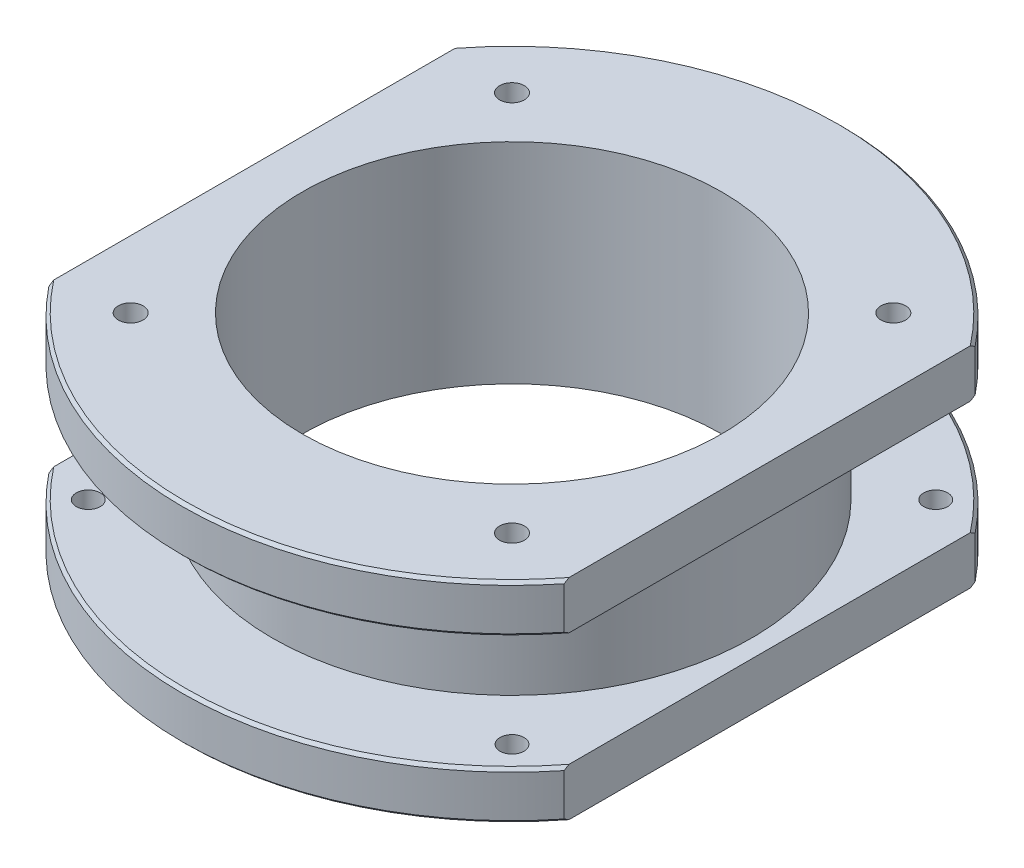
ISO-10303-21;
HEADER;
FILE_DESCRIPTION(('STEP AP214'),'2;1');
FILE_NAME('part.step','',(''),(''),'','','');
FILE_SCHEMA(('AUTOMOTIVE_DESIGN { 1 0 10303 214 1 1 1 1 }'));
ENDSEC;
DATA;
#1=APPLICATION_CONTEXT('core data for automotive mechanical design processes');
#2=APPLICATION_PROTOCOL_DEFINITION('international standard','automotive_design',2000,#1);
#3=PRODUCT_CONTEXT('',#1,'mechanical');
#4=PRODUCT('Part','Part','',(#3));
#5=PRODUCT_RELATED_PRODUCT_CATEGORY('part','',(#4));
#6=PRODUCT_DEFINITION_FORMATION('','',#4);
#7=PRODUCT_DEFINITION_CONTEXT('part definition',#1,'design');
#8=PRODUCT_DEFINITION('design','',#6,#7);
#9=PRODUCT_DEFINITION_SHAPE('','',#8);
#10=(LENGTH_UNIT() NAMED_UNIT(*) SI_UNIT(.MILLI.,.METRE.));
#11=(NAMED_UNIT(*) PLANE_ANGLE_UNIT() SI_UNIT($,.RADIAN.));
#12=(NAMED_UNIT(*) SI_UNIT($,.STERADIAN.) SOLID_ANGLE_UNIT());
#13=UNCERTAINTY_MEASURE_WITH_UNIT(LENGTH_MEASURE(1.E-05),#10,'distance_accuracy_value','');
#14=(GEOMETRIC_REPRESENTATION_CONTEXT(3) GLOBAL_UNCERTAINTY_ASSIGNED_CONTEXT((#13)) GLOBAL_UNIT_ASSIGNED_CONTEXT((#10,
#11,#12)) REPRESENTATION_CONTEXT('',''));
#15=CARTESIAN_POINT('',(0.,0.,0.));
#16=DIRECTION('',(0.,0.,1.));
#17=DIRECTION('',(1.,0.,0.));
#18=AXIS2_PLACEMENT_3D('',#15,#16,#17);
#19=CARTESIAN_POINT('',(0.,17.5,0.));
#20=DIRECTION('',(0.,-1.,0.));
#21=DIRECTION('',(0.,0.,-1.));
#22=AXIS2_PLACEMENT_3D('',#19,#20,#21);
#23=CYLINDRICAL_SURFACE('',#22,40.);
#24=CARTESIAN_POINT('',(0.,8.,0.));
#25=DIRECTION('',(0.,-1.,0.));
#26=DIRECTION('',(1.,0.,0.));
#27=AXIS2_PLACEMENT_3D('',#24,#25,#26);
#28=CIRCLE('',#27,40.);
#29=CARTESIAN_POINT('',(0.,8.,40.));
#30=VERTEX_POINT('',#29);
#31=EDGE_CURVE('E372',#30,#30,#28,.T.);
#32=ORIENTED_EDGE('',*,*,#31,.F.);
#33=DIRECTION('',(0.,1.,0.));
#34=VECTOR('',#33,1.);
#35=CARTESIAN_POINT('',(0.,17.5,40.));
#36=LINE('',#35,#34);
#37=CARTESIAN_POINT('',(0.,27.,40.));
#38=VERTEX_POINT('',#37);
#39=EDGE_CURVE('E11',#30,#38,#36,.T.);
#40=ORIENTED_EDGE('',*,*,#39,.T.);
#41=CARTESIAN_POINT('',(0.,27.,0.));
#42=DIRECTION('',(0.,-1.,0.));
#43=DIRECTION('',(1.,0.,0.));
#44=AXIS2_PLACEMENT_3D('',#41,#42,#43);
#45=CIRCLE('',#44,40.);
#46=EDGE_CURVE('E419',#38,#38,#45,.T.);
#47=ORIENTED_EDGE('',*,*,#46,.T.);
#48=ORIENTED_EDGE('',*,*,#39,.F.);
#49=EDGE_LOOP('',(#32,#40,#47,#48));
#50=FACE_BOUND('',#49,.T.);
#51=ADVANCED_FACE('F17',(#50),#23,.T.);
#52=CARTESIAN_POINT('',(0.,17.5,0.));
#53=DIRECTION('',(0.,-1.,0.));
#54=DIRECTION('',(0.,0.,-1.));
#55=AXIS2_PLACEMENT_3D('',#52,#53,#54);
#56=CYLINDRICAL_SURFACE('',#55,35.);
#57=CARTESIAN_POINT('',(0.,0.,0.));
#58=DIRECTION('',(0.,-1.,0.));
#59=DIRECTION('',(1.,0.,0.));
#60=AXIS2_PLACEMENT_3D('',#57,#58,#59);
#61=CIRCLE('',#60,35.);
#62=CARTESIAN_POINT('',(0.,0.,35.));
#63=VERTEX_POINT('',#62);
#64=EDGE_CURVE('E377',#63,#63,#61,.T.);
#65=ORIENTED_EDGE('',*,*,#64,.T.);
#66=DIRECTION('',(0.,1.,0.));
#67=VECTOR('',#66,1.);
#68=CARTESIAN_POINT('',(0.,17.5,35.));
#69=LINE('',#68,#67);
#70=CARTESIAN_POINT('',(0.,35.,35.));
#71=VERTEX_POINT('',#70);
#72=EDGE_CURVE('E28',#63,#71,#69,.T.);
#73=ORIENTED_EDGE('',*,*,#72,.T.);
#74=CARTESIAN_POINT('',(0.,35.,0.));
#75=DIRECTION('',(0.,-1.,0.));
#76=DIRECTION('',(1.,0.,0.));
#77=AXIS2_PLACEMENT_3D('',#74,#75,#76);
#78=CIRCLE('',#77,35.);
#79=EDGE_CURVE('E294',#71,#71,#78,.T.);
#80=ORIENTED_EDGE('',*,*,#79,.F.);
#81=ORIENTED_EDGE('',*,*,#72,.F.);
#82=EDGE_LOOP('',(#65,#73,#80,#81));
#83=FACE_BOUND('',#82,.T.);
#84=ADVANCED_FACE('F657',(#83),#56,.F.);
#85=CARTESIAN_POINT('',(-31.8198051533946,-124.45218719102,-31.8198051533946));
#86=DIRECTION('',(0.,1.,0.));
#87=DIRECTION('',(1.,0.,0.));
#88=AXIS2_PLACEMENT_3D('',#85,#86,#87);
#89=CYLINDRICAL_SURFACE('',#88,2.067);
#90=CARTESIAN_POINT('',(-31.8198051533946,35.,-31.8198051533946));
#91=DIRECTION('',(0.,-1.,0.));
#92=DIRECTION('',(1.,0.,0.));
#93=AXIS2_PLACEMENT_3D('',#90,#91,#92);
#94=CIRCLE('',#93,2.067);
#95=CARTESIAN_POINT('',(-33.8868051533946,35.,-31.8198051533946));
#96=VERTEX_POINT('',#95);
#97=EDGE_CURVE('E290',#96,#96,#94,.T.);
#98=ORIENTED_EDGE('',*,*,#97,.F.);
#99=DIRECTION('',(0.,-1.,0.));
#100=VECTOR('',#99,1.);
#101=CARTESIAN_POINT('',(-33.8868051533946,-124.45218719102,-31.8198051533946));
#102=LINE('',#101,#100);
#103=CARTESIAN_POINT('',(-33.8868051533946,27.,-31.8198051533946));
#104=VERTEX_POINT('',#103);
#105=EDGE_CURVE('E218',#96,#104,#102,.T.);
#106=ORIENTED_EDGE('',*,*,#105,.T.);
#107=CARTESIAN_POINT('',(-31.8198051533946,27.,-31.8198051533946));
#108=DIRECTION('',(0.,1.,0.));
#109=DIRECTION('',(1.,0.,0.));
#110=AXIS2_PLACEMENT_3D('',#107,#108,#109);
#111=CIRCLE('',#110,2.067);
#112=EDGE_CURVE('E412',#104,#104,#111,.T.);
#113=ORIENTED_EDGE('',*,*,#112,.F.);
#114=ORIENTED_EDGE('',*,*,#105,.F.);
#115=EDGE_LOOP('',(#98,#106,#113,#114));
#116=FACE_BOUND('',#115,.T.);
#117=ADVANCED_FACE('F663',(#116),#89,.F.);
#118=CARTESIAN_POINT('',(31.8198051533946,-124.45218719102,31.8198051533946));
#119=DIRECTION('',(0.,1.,0.));
#120=DIRECTION('',(1.,0.,0.));
#121=AXIS2_PLACEMENT_3D('',#118,#119,#120);
#122=CYLINDRICAL_SURFACE('',#121,2.067);
#123=CARTESIAN_POINT('',(31.8198051533946,35.,31.8198051533946));
#124=DIRECTION('',(0.,-1.,0.));
#125=DIRECTION('',(1.,0.,0.));
#126=AXIS2_PLACEMENT_3D('',#123,#124,#125);
#127=CIRCLE('',#126,2.067);
#128=CARTESIAN_POINT('',(29.7528051533946,35.,31.8198051533946));
#129=VERTEX_POINT('',#128);
#130=EDGE_CURVE('E293',#129,#129,#127,.T.);
#131=ORIENTED_EDGE('',*,*,#130,.F.);
#132=DIRECTION('',(0.,-1.,0.));
#133=VECTOR('',#132,1.);
#134=CARTESIAN_POINT('',(29.7528051533946,-124.45218719102,31.8198051533946));
#135=LINE('',#134,#133);
#136=CARTESIAN_POINT('',(29.7528051533946,27.,31.8198051533946));
#137=VERTEX_POINT('',#136);
#138=EDGE_CURVE('E229',#129,#137,#135,.T.);
#139=ORIENTED_EDGE('',*,*,#138,.T.);
#140=CARTESIAN_POINT('',(31.8198051533946,27.,31.8198051533946));
#141=DIRECTION('',(0.,1.,0.));
#142=DIRECTION('',(1.,0.,0.));
#143=AXIS2_PLACEMENT_3D('',#140,#141,#142);
#144=CIRCLE('',#143,2.067);
#145=EDGE_CURVE('E366',#137,#137,#144,.T.);
#146=ORIENTED_EDGE('',*,*,#145,.F.);
#147=ORIENTED_EDGE('',*,*,#138,.F.);
#148=EDGE_LOOP('',(#131,#139,#146,#147));
#149=FACE_BOUND('',#148,.T.);
#150=ADVANCED_FACE('F700',(#149),#122,.F.);
#151=CARTESIAN_POINT('',(-31.8198051533946,-124.45218719102,31.8198051533946));
#152=DIRECTION('',(0.,1.,0.));
#153=DIRECTION('',(1.,0.,0.));
#154=AXIS2_PLACEMENT_3D('',#151,#152,#153);
#155=CYLINDRICAL_SURFACE('',#154,2.067);
#156=CARTESIAN_POINT('',(-31.8198051533946,35.,31.8198051533946));
#157=DIRECTION('',(0.,-1.,0.));
#158=DIRECTION('',(1.,0.,0.));
#159=AXIS2_PLACEMENT_3D('',#156,#157,#158);
#160=CIRCLE('',#159,2.067);
#161=CARTESIAN_POINT('',(-33.8868051533946,35.,31.8198051533946));
#162=VERTEX_POINT('',#161);
#163=EDGE_CURVE('E480',#162,#162,#160,.T.);
#164=ORIENTED_EDGE('',*,*,#163,.F.);
#165=DIRECTION('',(0.,-1.,0.));
#166=VECTOR('',#165,1.);
#167=CARTESIAN_POINT('',(-33.8868051533946,-124.45218719102,31.8198051533946));
#168=LINE('',#167,#166);
#169=CARTESIAN_POINT('',(-33.8868051533946,27.,31.8198051533946));
#170=VERTEX_POINT('',#169);
#171=EDGE_CURVE('E483',#162,#170,#168,.T.);
#172=ORIENTED_EDGE('',*,*,#171,.T.);
#173=CARTESIAN_POINT('',(-31.8198051533946,27.,31.8198051533946));
#174=DIRECTION('',(0.,1.,0.));
#175=DIRECTION('',(1.,0.,0.));
#176=AXIS2_PLACEMENT_3D('',#173,#174,#175);
#177=CIRCLE('',#176,2.067);
#178=EDGE_CURVE('E362',#170,#170,#177,.T.);
#179=ORIENTED_EDGE('',*,*,#178,.F.);
#180=ORIENTED_EDGE('',*,*,#171,.F.);
#181=EDGE_LOOP('',(#164,#172,#179,#180));
#182=FACE_BOUND('',#181,.T.);
#183=ADVANCED_FACE('F19',(#182),#155,.F.);
#184=CARTESIAN_POINT('',(31.8198051533946,-124.45218719102,-31.8198051533946));
#185=DIRECTION('',(0.,1.,0.));
#186=DIRECTION('',(1.,0.,0.));
#187=AXIS2_PLACEMENT_3D('',#184,#185,#186);
#188=CYLINDRICAL_SURFACE('',#187,2.067);
#189=CARTESIAN_POINT('',(31.8198051533946,35.,-31.8198051533946));
#190=DIRECTION('',(0.,-1.,0.));
#191=DIRECTION('',(1.,0.,0.));
#192=AXIS2_PLACEMENT_3D('',#189,#190,#191);
#193=CIRCLE('',#192,2.067);
#194=CARTESIAN_POINT('',(29.7528051533946,35.,-31.8198051533946));
#195=VERTEX_POINT('',#194);
#196=EDGE_CURVE('E498',#195,#195,#193,.T.);
#197=ORIENTED_EDGE('',*,*,#196,.F.);
#198=DIRECTION('',(0.,-1.,0.));
#199=VECTOR('',#198,1.);
#200=CARTESIAN_POINT('',(29.7528051533946,-124.45218719102,-31.8198051533946));
#201=LINE('',#200,#199);
#202=CARTESIAN_POINT('',(29.7528051533946,27.,-31.8198051533946));
#203=VERTEX_POINT('',#202);
#204=EDGE_CURVE('E42',#195,#203,#201,.T.);
#205=ORIENTED_EDGE('',*,*,#204,.T.);
#206=CARTESIAN_POINT('',(31.8198051533946,27.,-31.8198051533946));
#207=DIRECTION('',(0.,1.,0.));
#208=DIRECTION('',(1.,0.,0.));
#209=AXIS2_PLACEMENT_3D('',#206,#207,#208);
#210=CIRCLE('',#209,2.067);
#211=EDGE_CURVE('E250',#203,#203,#210,.T.);
#212=ORIENTED_EDGE('',*,*,#211,.F.);
#213=ORIENTED_EDGE('',*,*,#204,.F.);
#214=EDGE_LOOP('',(#197,#205,#212,#213));
#215=FACE_BOUND('',#214,.T.);
#216=ADVANCED_FACE('F638',(#215),#188,.F.);
#217=CARTESIAN_POINT('',(-35.3553390593274,159.45218719102,35.3553390593274));
#218=DIRECTION('',(0.,-1.,0.));
#219=DIRECTION('',(1.,0.,0.));
#220=AXIS2_PLACEMENT_3D('',#217,#218,#219);
#221=CYLINDRICAL_SURFACE('',#220,2.);
#222=CARTESIAN_POINT('',(-35.3553390593274,0.,35.3553390593274));
#223=DIRECTION('',(0.,1.,0.));
#224=DIRECTION('',(1.,0.,0.));
#225=AXIS2_PLACEMENT_3D('',#222,#223,#224);
#226=CIRCLE('',#225,2.);
#227=CARTESIAN_POINT('',(-37.3553390593274,0.,35.3553390593274));
#228=VERTEX_POINT('',#227);
#229=EDGE_CURVE('E373',#228,#228,#226,.T.);
#230=ORIENTED_EDGE('',*,*,#229,.F.);
#231=DIRECTION('',(0.,1.,0.));
#232=VECTOR('',#231,1.);
#233=CARTESIAN_POINT('',(-37.3553390593274,159.45218719102,35.3553390593274));
#234=LINE('',#233,#232);
#235=CARTESIAN_POINT('',(-37.3553390593274,8.,35.3553390593274));
#236=VERTEX_POINT('',#235);
#237=EDGE_CURVE('E484',#228,#236,#234,.T.);
#238=ORIENTED_EDGE('',*,*,#237,.T.);
#239=CARTESIAN_POINT('',(-35.3553390593274,8.,35.3553390593274));
#240=DIRECTION('',(0.,-1.,0.));
#241=DIRECTION('',(1.,0.,0.));
#242=AXIS2_PLACEMENT_3D('',#239,#240,#241);
#243=CIRCLE('',#242,2.);
#244=EDGE_CURVE('E367',#236,#236,#243,.T.);
#245=ORIENTED_EDGE('',*,*,#244,.F.);
#246=ORIENTED_EDGE('',*,*,#237,.F.);
#247=EDGE_LOOP('',(#230,#238,#245,#246));
#248=FACE_BOUND('',#247,.T.);
#249=ADVANCED_FACE('F683',(#248),#221,.F.);
#250=CARTESIAN_POINT('',(35.3553390593274,159.45218719102,-35.3553390593274));
#251=DIRECTION('',(0.,-1.,0.));
#252=DIRECTION('',(1.,0.,0.));
#253=AXIS2_PLACEMENT_3D('',#250,#251,#252);
#254=CYLINDRICAL_SURFACE('',#253,2.);
#255=CARTESIAN_POINT('',(35.3553390593274,0.,-35.3553390593274));
#256=DIRECTION('',(0.,1.,0.));
#257=DIRECTION('',(1.,0.,0.));
#258=AXIS2_PLACEMENT_3D('',#255,#256,#257);
#259=CIRCLE('',#258,2.);
#260=CARTESIAN_POINT('',(33.3553390593274,0.,-35.3553390593274));
#261=VERTEX_POINT('',#260);
#262=EDGE_CURVE('E330',#261,#261,#259,.T.);
#263=ORIENTED_EDGE('',*,*,#262,.F.);
#264=DIRECTION('',(0.,1.,0.));
#265=VECTOR('',#264,1.);
#266=CARTESIAN_POINT('',(33.3553390593274,159.45218719102,-35.3553390593274));
#267=LINE('',#266,#265);
#268=CARTESIAN_POINT('',(33.3553390593274,8.,-35.3553390593274));
#269=VERTEX_POINT('',#268);
#270=EDGE_CURVE('E487',#261,#269,#267,.T.);
#271=ORIENTED_EDGE('',*,*,#270,.T.);
#272=CARTESIAN_POINT('',(35.3553390593274,8.,-35.3553390593274));
#273=DIRECTION('',(0.,-1.,0.));
#274=DIRECTION('',(1.,0.,0.));
#275=AXIS2_PLACEMENT_3D('',#272,#273,#274);
#276=CIRCLE('',#275,2.);
#277=EDGE_CURVE('E371',#269,#269,#276,.T.);
#278=ORIENTED_EDGE('',*,*,#277,.F.);
#279=ORIENTED_EDGE('',*,*,#270,.F.);
#280=EDGE_LOOP('',(#263,#271,#278,#279));
#281=FACE_BOUND('',#280,.T.);
#282=ADVANCED_FACE('F686',(#281),#254,.F.);
#283=CARTESIAN_POINT('',(-35.3553390593274,159.45218719102,-35.3553390593274));
#284=DIRECTION('',(0.,-1.,0.));
#285=DIRECTION('',(1.,0.,0.));
#286=AXIS2_PLACEMENT_3D('',#283,#284,#285);
#287=CYLINDRICAL_SURFACE('',#286,2.);
#288=CARTESIAN_POINT('',(-35.3553390593274,0.,-35.3553390593274));
#289=DIRECTION('',(0.,1.,0.));
#290=DIRECTION('',(1.,0.,0.));
#291=AXIS2_PLACEMENT_3D('',#288,#289,#290);
#292=CIRCLE('',#291,2.);
#293=CARTESIAN_POINT('',(-37.3553390593274,0.,-35.3553390593274));
#294=VERTEX_POINT('',#293);
#295=EDGE_CURVE('E323',#294,#294,#292,.T.);
#296=ORIENTED_EDGE('',*,*,#295,.F.);
#297=DIRECTION('',(0.,1.,0.));
#298=VECTOR('',#297,1.);
#299=CARTESIAN_POINT('',(-37.3553390593274,159.45218719102,-35.3553390593274));
#300=LINE('',#299,#298);
#301=CARTESIAN_POINT('',(-37.3553390593274,8.,-35.3553390593274));
#302=VERTEX_POINT('',#301);
#303=EDGE_CURVE('E497',#294,#302,#300,.T.);
#304=ORIENTED_EDGE('',*,*,#303,.T.);
#305=CARTESIAN_POINT('',(-35.3553390593274,8.,-35.3553390593274));
#306=DIRECTION('',(0.,-1.,0.));
#307=DIRECTION('',(1.,0.,0.));
#308=AXIS2_PLACEMENT_3D('',#305,#306,#307);
#309=CIRCLE('',#308,2.);
#310=EDGE_CURVE('E513',#302,#302,#309,.T.);
#311=ORIENTED_EDGE('',*,*,#310,.F.);
#312=ORIENTED_EDGE('',*,*,#303,.F.);
#313=EDGE_LOOP('',(#296,#304,#311,#312));
#314=FACE_BOUND('',#313,.T.);
#315=ADVANCED_FACE('F671',(#314),#287,.F.);
#316=CARTESIAN_POINT('',(35.3553390593274,159.45218719102,35.3553390593274));
#317=DIRECTION('',(0.,-1.,0.));
#318=DIRECTION('',(1.,0.,0.));
#319=AXIS2_PLACEMENT_3D('',#316,#317,#318);
#320=CYLINDRICAL_SURFACE('',#319,2.);
#321=CARTESIAN_POINT('',(35.3553390593274,0.,35.3553390593274));
#322=DIRECTION('',(0.,1.,0.));
#323=DIRECTION('',(1.,0.,0.));
#324=AXIS2_PLACEMENT_3D('',#321,#322,#323);
#325=CIRCLE('',#324,2.);
#326=CARTESIAN_POINT('',(33.3553390593274,0.,35.3553390593274));
#327=VERTEX_POINT('',#326);
#328=EDGE_CURVE('E288',#327,#327,#325,.T.);
#329=ORIENTED_EDGE('',*,*,#328,.F.);
#330=DIRECTION('',(0.,1.,0.));
#331=VECTOR('',#330,1.);
#332=CARTESIAN_POINT('',(33.3553390593274,159.45218719102,35.3553390593274));
#333=LINE('',#332,#331);
#334=CARTESIAN_POINT('',(33.3553390593274,8.,35.3553390593274));
#335=VERTEX_POINT('',#334);
#336=EDGE_CURVE('E494',#327,#335,#333,.T.);
#337=ORIENTED_EDGE('',*,*,#336,.T.);
#338=CARTESIAN_POINT('',(35.3553390593274,8.,35.3553390593274));
#339=DIRECTION('',(0.,-1.,0.));
#340=DIRECTION('',(1.,0.,0.));
#341=AXIS2_PLACEMENT_3D('',#338,#339,#340);
#342=CIRCLE('',#341,2.);
#343=EDGE_CURVE('E21',#335,#335,#342,.T.);
#344=ORIENTED_EDGE('',*,*,#343,.F.);
#345=ORIENTED_EDGE('',*,*,#336,.F.);
#346=EDGE_LOOP('',(#329,#337,#344,#345));
#347=FACE_BOUND('',#346,.T.);
#348=ADVANCED_FACE('F668',(#347),#320,.F.);
#349=CARTESIAN_POINT('',(0.,35.,-55.));
#350=DIRECTION('',(0.,1.,0.));
#351=DIRECTION('',(1.,0.,0.));
#352=AXIS2_PLACEMENT_3D('',#349,#350,#351);
#353=PLANE('',#352);
#354=ORIENTED_EDGE('',*,*,#196,.T.);
#355=EDGE_LOOP('',(#354));
#356=FACE_BOUND('',#355,.T.);
#357=ORIENTED_EDGE('',*,*,#163,.T.);
#358=EDGE_LOOP('',(#357));
#359=FACE_BOUND('',#358,.T.);
#360=ORIENTED_EDGE('',*,*,#130,.T.);
#361=EDGE_LOOP('',(#360));
#362=FACE_BOUND('',#361,.T.);
#363=ORIENTED_EDGE('',*,*,#97,.T.);
#364=EDGE_LOOP('',(#363));
#365=FACE_BOUND('',#364,.T.);
#366=ORIENTED_EDGE('',*,*,#79,.T.);
#367=EDGE_LOOP('',(#366));
#368=FACE_BOUND('',#367,.T.);
#369=DIRECTION('',(0.,0.,-1.));
#370=VECTOR('',#369,1.);
#371=CARTESIAN_POINT('',(43.,35.,-10.3535718005178));
#372=LINE('',#371,#370);
#373=CARTESIAN_POINT('',(43.,35.,33.4850713005064));
#374=VERTEX_POINT('',#373);
#375=CARTESIAN_POINT('',(43.,35.,-33.4850713005064));
#376=VERTEX_POINT('',#375);
#377=EDGE_CURVE('E301',#374,#376,#372,.T.);
#378=ORIENTED_EDGE('',*,*,#377,.T.);
#379=CARTESIAN_POINT('',(0.,35.,0.));
#380=DIRECTION('',(0.,-1.,0.));
#381=DIRECTION('',(0.,0.,1.));
#382=AXIS2_PLACEMENT_3D('',#379,#380,#381);
#383=CIRCLE('',#382,54.5);
#384=CARTESIAN_POINT('',(-43.,35.,-33.4850713005064));
#385=VERTEX_POINT('',#384);
#386=EDGE_CURVE('E284',#385,#376,#383,.T.);
#387=ORIENTED_EDGE('',*,*,#386,.F.);
#388=DIRECTION('',(0.,0.,1.));
#389=VECTOR('',#388,1.);
#390=CARTESIAN_POINT('',(-43.,35.,-44.6464281994822));
#391=LINE('',#390,#389);
#392=CARTESIAN_POINT('',(-43.,35.,33.4850713005064));
#393=VERTEX_POINT('',#392);
#394=EDGE_CURVE('E309',#385,#393,#391,.T.);
#395=ORIENTED_EDGE('',*,*,#394,.T.);
#396=CARTESIAN_POINT('',(0.,35.,0.));
#397=DIRECTION('',(0.,-1.,0.));
#398=DIRECTION('',(0.,0.,1.));
#399=AXIS2_PLACEMENT_3D('',#396,#397,#398);
#400=CIRCLE('',#399,54.5);
#401=EDGE_CURVE('E398',#374,#393,#400,.T.);
#402=ORIENTED_EDGE('',*,*,#401,.F.);
#403=EDGE_LOOP('',(#378,#387,#395,#402));
#404=FACE_BOUND('',#403,.T.);
#405=ADVANCED_FACE('F625',(#356,#359,#362,#365,#368,#404),#353,.T.);
#406=CARTESIAN_POINT('',(0.,8.,-55.));
#407=DIRECTION('',(0.,1.,0.));
#408=DIRECTION('',(1.,0.,0.));
#409=AXIS2_PLACEMENT_3D('',#406,#407,#408);
#410=PLANE('',#409);
#411=ORIENTED_EDGE('',*,*,#343,.T.);
#412=EDGE_LOOP('',(#411));
#413=FACE_BOUND('',#412,.T.);
#414=ORIENTED_EDGE('',*,*,#310,.T.);
#415=EDGE_LOOP('',(#414));
#416=FACE_BOUND('',#415,.T.);
#417=ORIENTED_EDGE('',*,*,#277,.T.);
#418=EDGE_LOOP('',(#417));
#419=FACE_BOUND('',#418,.T.);
#420=ORIENTED_EDGE('',*,*,#244,.T.);
#421=EDGE_LOOP('',(#420));
#422=FACE_BOUND('',#421,.T.);
#423=ORIENTED_EDGE('',*,*,#31,.T.);
#424=EDGE_LOOP('',(#423));
#425=FACE_BOUND('',#424,.T.);
#426=DIRECTION('',(0.,0.,-1.));
#427=VECTOR('',#426,1.);
#428=CARTESIAN_POINT('',(43.,8.,-10.3535718005178));
#429=LINE('',#428,#427);
#430=CARTESIAN_POINT('',(43.,8.,33.4850713005064));
#431=VERTEX_POINT('',#430);
#432=CARTESIAN_POINT('',(43.,8.,-33.4850713005064));
#433=VERTEX_POINT('',#432);
#434=EDGE_CURVE('E341',#431,#433,#429,.T.);
#435=ORIENTED_EDGE('',*,*,#434,.T.);
#436=CARTESIAN_POINT('',(0.,8.,0.));
#437=DIRECTION('',(0.,-1.,0.));
#438=DIRECTION('',(0.,0.,1.));
#439=AXIS2_PLACEMENT_3D('',#436,#437,#438);
#440=CIRCLE('',#439,54.5);
#441=CARTESIAN_POINT('',(-43.,8.,-33.4850713005065));
#442=VERTEX_POINT('',#441);
#443=EDGE_CURVE('E440',#442,#433,#440,.T.);
#444=ORIENTED_EDGE('',*,*,#443,.F.);
#445=DIRECTION('',(0.,0.,1.));
#446=VECTOR('',#445,1.);
#447=CARTESIAN_POINT('',(-43.,8.,-44.6464281994823));
#448=LINE('',#447,#446);
#449=CARTESIAN_POINT('',(-43.,8.,33.4850713005064));
#450=VERTEX_POINT('',#449);
#451=EDGE_CURVE('E425',#442,#450,#448,.T.);
#452=ORIENTED_EDGE('',*,*,#451,.T.);
#453=CARTESIAN_POINT('',(0.,8.,0.));
#454=DIRECTION('',(0.,-1.,0.));
#455=DIRECTION('',(0.,0.,1.));
#456=AXIS2_PLACEMENT_3D('',#453,#454,#455);
#457=CIRCLE('',#456,54.5);
#458=EDGE_CURVE('E394',#431,#450,#457,.T.);
#459=ORIENTED_EDGE('',*,*,#458,.F.);
#460=EDGE_LOOP('',(#435,#444,#452,#459));
#461=FACE_BOUND('',#460,.T.);
#462=ADVANCED_FACE('F673',(#413,#416,#419,#422,#425,#461),#410,.T.);
#463=CARTESIAN_POINT('',(0.,27.25,0.));
#464=DIRECTION('',(0.,1.,0.));
#465=DIRECTION('',(0.,0.,-1.));
#466=AXIS2_PLACEMENT_3D('',#463,#464,#465);
#467=CONICAL_SURFACE('',#466,54.75,0.785398163397448);
#468=CARTESIAN_POINT('',(43.,27.5,-34.2928563989645));
#469=CARTESIAN_POINT('',(43.,27.247020471392,-33.8871195915208));
#470=CARTESIAN_POINT('',(43.,27.,-33.4850713005064));
#471=(BOUNDED_CURVE() B_SPLINE_CURVE(2,(#468,#469,#470),.UNSPECIFIED.,.F.,
.F.) B_SPLINE_CURVE_WITH_KNOTS((3,3),(0.,0.0950010109304205),
.UNSPECIFIED.) CURVE() GEOMETRIC_REPRESENTATION_ITEM() RATIONAL_B_SPLINE_CURVE((1.,
1.00002721140787,1.)) REPRESENTATION_ITEM(''));
#472=CARTESIAN_POINT('',(43.,27.5,-34.2928563989645));
#473=VERTEX_POINT('',#472);
#474=CARTESIAN_POINT('',(43.,27.,-33.4850713005064));
#475=VERTEX_POINT('',#474);
#476=EDGE_CURVE('E254',#473,#475,#471,.T.);
#477=ORIENTED_EDGE('',*,*,#476,.T.);
#478=CARTESIAN_POINT('',(0.,27.,0.));
#479=DIRECTION('',(0.,1.,0.));
#480=DIRECTION('',(0.,0.,1.));
#481=AXIS2_PLACEMENT_3D('',#478,#479,#480);
#482=CIRCLE('',#481,54.5);
#483=CARTESIAN_POINT('',(-43.,27.,-33.4850713005065));
#484=VERTEX_POINT('',#483);
#485=EDGE_CURVE('E238',#475,#484,#482,.T.);
#486=ORIENTED_EDGE('',*,*,#485,.T.);
#487=CARTESIAN_POINT('',(-43.,27.,-33.4850713005064));
#488=CARTESIAN_POINT('',(-43.,27.247020471392,-33.8871195915208));
#489=CARTESIAN_POINT('',(-43.,27.5,-34.2928563989645));
#490=(BOUNDED_CURVE() B_SPLINE_CURVE(2,(#487,#488,#489),.UNSPECIFIED.,.F.,
.F.) B_SPLINE_CURVE_WITH_KNOTS((3,3),(0.,0.0950010109304205),
.UNSPECIFIED.) CURVE() GEOMETRIC_REPRESENTATION_ITEM() RATIONAL_B_SPLINE_CURVE((1.,
1.00002721140787,1.)) REPRESENTATION_ITEM(''));
#491=CARTESIAN_POINT('',(-43.,27.5,-34.2928563989645));
#492=VERTEX_POINT('',#491);
#493=EDGE_CURVE('E389',#484,#492,#490,.T.);
#494=ORIENTED_EDGE('',*,*,#493,.T.);
#495=CARTESIAN_POINT('',(0.,27.5,0.));
#496=DIRECTION('',(0.,-1.,0.));
#497=DIRECTION('',(0.,0.,1.));
#498=AXIS2_PLACEMENT_3D('',#495,#496,#497);
#499=CIRCLE('',#498,55.);
#500=EDGE_CURVE('E256',#492,#473,#499,.T.);
#501=ORIENTED_EDGE('',*,*,#500,.T.);
#502=EDGE_LOOP('',(#477,#486,#494,#501));
#503=FACE_BOUND('',#502,.T.);
#504=ADVANCED_FACE('F255',(#503),#467,.T.);
#505=CARTESIAN_POINT('',(0.,27.25,0.));
#506=DIRECTION('',(0.,1.,0.));
#507=DIRECTION('',(0.,0.,1.));
#508=AXIS2_PLACEMENT_3D('',#505,#506,#507);
#509=CONICAL_SURFACE('',#508,54.75,0.785398163397448);
#510=CARTESIAN_POINT('',(43.,27.,33.4850713005064));
#511=CARTESIAN_POINT('',(43.,27.2470204713927,33.8871195915219));
#512=CARTESIAN_POINT('',(43.,27.5,34.2928563989645));
#513=(BOUNDED_CURVE() B_SPLINE_CURVE(2,(#510,#511,#512),.UNSPECIFIED.,.F.,
.F.) B_SPLINE_CURVE_WITH_KNOTS((3,3),(0.,0.0950010109304205),
.UNSPECIFIED.) CURVE() GEOMETRIC_REPRESENTATION_ITEM() RATIONAL_B_SPLINE_CURVE((1.,
1.0000272114087,1.)) REPRESENTATION_ITEM(''));
#514=CARTESIAN_POINT('',(43.,27.,33.4850713005064));
#515=VERTEX_POINT('',#514);
#516=CARTESIAN_POINT('',(43.,27.5,34.2928563989645));
#517=VERTEX_POINT('',#516);
#518=EDGE_CURVE('E267',#515,#517,#513,.T.);
#519=ORIENTED_EDGE('',*,*,#518,.T.);
#520=CARTESIAN_POINT('',(0.,27.5,0.));
#521=DIRECTION('',(0.,-1.,0.));
#522=DIRECTION('',(0.,0.,1.));
#523=AXIS2_PLACEMENT_3D('',#520,#521,#522);
#524=CIRCLE('',#523,55.);
#525=CARTESIAN_POINT('',(-43.,27.5,34.2928563989645));
#526=VERTEX_POINT('',#525);
#527=EDGE_CURVE('E282',#517,#526,#524,.T.);
#528=ORIENTED_EDGE('',*,*,#527,.T.);
#529=CARTESIAN_POINT('',(-43.,27.5,34.2928563989645));
#530=CARTESIAN_POINT('',(-43.,27.2470204713922,33.8871195915211));
#531=CARTESIAN_POINT('',(-43.,27.,33.4850713005064));
#532=(BOUNDED_CURVE() B_SPLINE_CURVE(2,(#529,#530,#531),.UNSPECIFIED.,.F.,
.F.) B_SPLINE_CURVE_WITH_KNOTS((3,3),(0.,0.0950010109304209),
.UNSPECIFIED.) CURVE() GEOMETRIC_REPRESENTATION_ITEM() RATIONAL_B_SPLINE_CURVE((1.,
1.00002721141701,1.)) REPRESENTATION_ITEM(''));
#533=CARTESIAN_POINT('',(-43.,27.,33.4850713005064));
#534=VERTEX_POINT('',#533);
#535=EDGE_CURVE('E388',#526,#534,#532,.T.);
#536=ORIENTED_EDGE('',*,*,#535,.T.);
#537=CARTESIAN_POINT('',(0.,27.,0.));
#538=DIRECTION('',(0.,1.,0.));
#539=DIRECTION('',(0.,0.,1.));
#540=AXIS2_PLACEMENT_3D('',#537,#538,#539);
#541=CIRCLE('',#540,54.5);
#542=EDGE_CURVE('E251',#534,#515,#541,.T.);
#543=ORIENTED_EDGE('',*,*,#542,.T.);
#544=EDGE_LOOP('',(#519,#528,#536,#543));
#545=FACE_BOUND('',#544,.T.);
#546=ADVANCED_FACE('F642',(#545),#509,.T.);
#547=CARTESIAN_POINT('',(0.,27.,-40.));
#548=DIRECTION('',(0.,-1.,0.));
#549=DIRECTION('',(0.,0.,-1.));
#550=AXIS2_PLACEMENT_3D('',#547,#548,#549);
#551=PLANE('',#550);
#552=ORIENTED_EDGE('',*,*,#46,.F.);
#553=EDGE_LOOP('',(#552));
#554=FACE_BOUND('',#553,.T.);
#555=ORIENTED_EDGE('',*,*,#112,.T.);
#556=EDGE_LOOP('',(#555));
#557=FACE_BOUND('',#556,.T.);
#558=ORIENTED_EDGE('',*,*,#145,.T.);
#559=EDGE_LOOP('',(#558));
#560=FACE_BOUND('',#559,.T.);
#561=ORIENTED_EDGE('',*,*,#178,.T.);
#562=EDGE_LOOP('',(#561));
#563=FACE_BOUND('',#562,.T.);
#564=ORIENTED_EDGE('',*,*,#211,.T.);
#565=EDGE_LOOP('',(#564));
#566=FACE_BOUND('',#565,.T.);
#567=DIRECTION('',(0.,0.,1.));
#568=VECTOR('',#567,1.);
#569=CARTESIAN_POINT('',(43.,27.,-2.85357180051776));
#570=LINE('',#569,#568);
#571=EDGE_CURVE('E242',#475,#515,#570,.T.);
#572=ORIENTED_EDGE('',*,*,#571,.T.);
#573=ORIENTED_EDGE('',*,*,#542,.F.);
#574=DIRECTION('',(0.,0.,-1.));
#575=VECTOR('',#574,1.);
#576=CARTESIAN_POINT('',(-43.,27.,-37.1464281994823));
#577=LINE('',#576,#575);
#578=EDGE_CURVE('E245',#534,#484,#577,.T.);
#579=ORIENTED_EDGE('',*,*,#578,.T.);
#580=ORIENTED_EDGE('',*,*,#485,.F.);
#581=EDGE_LOOP('',(#572,#573,#579,#580));
#582=FACE_BOUND('',#581,.T.);
#583=ADVANCED_FACE('F240',(#554,#557,#560,#563,#566,#582),#551,.T.);
#584=CARTESIAN_POINT('',(0.,31.,0.));
#585=DIRECTION('',(0.,-1.,0.));
#586=DIRECTION('',(0.,0.,-1.));
#587=AXIS2_PLACEMENT_3D('',#584,#585,#586);
#588=CYLINDRICAL_SURFACE('',#587,55.);
#589=DIRECTION('',(0.,-1.,0.));
#590=VECTOR('',#589,1.);
#591=CARTESIAN_POINT('',(43.,31.,-34.2928563989645));
#592=LINE('',#591,#590);
#593=CARTESIAN_POINT('',(43.,34.5,-34.2928563989645));
#594=VERTEX_POINT('',#593);
#595=EDGE_CURVE('E261',#594,#473,#592,.T.);
#596=ORIENTED_EDGE('',*,*,#595,.T.);
#597=ORIENTED_EDGE('',*,*,#500,.F.);
#598=DIRECTION('',(0.,1.,0.));
#599=VECTOR('',#598,1.);
#600=CARTESIAN_POINT('',(-43.,31.,-34.2928563989645));
#601=LINE('',#600,#599);
#602=CARTESIAN_POINT('',(-43.,34.5,-34.2928563989645));
#603=VERTEX_POINT('',#602);
#604=EDGE_CURVE('E411',#492,#603,#601,.T.);
#605=ORIENTED_EDGE('',*,*,#604,.T.);
#606=CARTESIAN_POINT('',(0.,34.5,0.));
#607=DIRECTION('',(0.,1.,0.));
#608=DIRECTION('',(0.,0.,1.));
#609=AXIS2_PLACEMENT_3D('',#606,#607,#608);
#610=CIRCLE('',#609,55.);
#611=EDGE_CURVE('E332',#594,#603,#610,.T.);
#612=ORIENTED_EDGE('',*,*,#611,.F.);
#613=EDGE_LOOP('',(#596,#597,#605,#612));
#614=FACE_BOUND('',#613,.T.);
#615=ADVANCED_FACE('F641',(#614),#588,.T.);
#616=CARTESIAN_POINT('',(0.,31.,0.));
#617=DIRECTION('',(0.,-1.,0.));
#618=DIRECTION('',(0.,0.,1.));
#619=AXIS2_PLACEMENT_3D('',#616,#617,#618);
#620=CYLINDRICAL_SURFACE('',#619,55.);
#621=DIRECTION('',(0.,1.,0.));
#622=VECTOR('',#621,1.);
#623=CARTESIAN_POINT('',(43.,31.,34.2928563989645));
#624=LINE('',#623,#622);
#625=CARTESIAN_POINT('',(43.,34.5,34.2928563989645));
#626=VERTEX_POINT('',#625);
#627=EDGE_CURVE('E274',#517,#626,#624,.T.);
#628=ORIENTED_EDGE('',*,*,#627,.T.);
#629=CARTESIAN_POINT('',(0.,34.5,0.));
#630=DIRECTION('',(0.,1.,0.));
#631=DIRECTION('',(0.,0.,1.));
#632=AXIS2_PLACEMENT_3D('',#629,#630,#631);
#633=CIRCLE('',#632,55.);
#634=CARTESIAN_POINT('',(-43.,34.5,34.2928563989645));
#635=VERTEX_POINT('',#634);
#636=EDGE_CURVE('E457',#635,#626,#633,.T.);
#637=ORIENTED_EDGE('',*,*,#636,.F.);
#638=DIRECTION('',(0.,-1.,0.));
#639=VECTOR('',#638,1.);
#640=CARTESIAN_POINT('',(-43.,31.,34.2928563989645));
#641=LINE('',#640,#639);
#642=EDGE_CURVE('E474',#635,#526,#641,.T.);
#643=ORIENTED_EDGE('',*,*,#642,.T.);
#644=ORIENTED_EDGE('',*,*,#527,.F.);
#645=EDGE_LOOP('',(#628,#637,#643,#644));
#646=FACE_BOUND('',#645,.T.);
#647=ADVANCED_FACE('F622',(#646),#620,.T.);
#648=CARTESIAN_POINT('',(0.,34.75,0.));
#649=DIRECTION('',(0.,-1.,0.));
#650=DIRECTION('',(0.,0.,-1.));
#651=AXIS2_PLACEMENT_3D('',#648,#649,#650);
#652=CONICAL_SURFACE('',#651,54.75,0.785398163397457);
#653=CARTESIAN_POINT('',(43.,35.,-33.4850713005064));
#654=CARTESIAN_POINT('',(43.,34.752979528607,-33.8871195915225));
#655=CARTESIAN_POINT('',(43.,34.5,-34.2928563989645));
#656=(BOUNDED_CURVE() B_SPLINE_CURVE(2,(#653,#654,#655),.UNSPECIFIED.,.F.,
.F.) B_SPLINE_CURVE_WITH_KNOTS((3,3),(0.,0.0950010109304226),
.UNSPECIFIED.) CURVE() GEOMETRIC_REPRESENTATION_ITEM() RATIONAL_B_SPLINE_CURVE((1.,
1.00002721139044,1.)) REPRESENTATION_ITEM(''));
#657=EDGE_CURVE('E295',#376,#594,#656,.T.);
#658=ORIENTED_EDGE('',*,*,#657,.T.);
#659=ORIENTED_EDGE('',*,*,#611,.T.);
#660=CARTESIAN_POINT('',(-43.,34.5,-34.2928563989645));
#661=CARTESIAN_POINT('',(-43.,34.7529795286071,-33.8871195915223));
#662=CARTESIAN_POINT('',(-43.,35.,-33.4850713005064));
#663=(BOUNDED_CURVE() B_SPLINE_CURVE(2,(#660,#661,#662),.UNSPECIFIED.,.F.,
.F.) B_SPLINE_CURVE_WITH_KNOTS((3,3),(0.,0.0950010109304206),
.UNSPECIFIED.) CURVE() GEOMETRIC_REPRESENTATION_ITEM() RATIONAL_B_SPLINE_CURVE((1.,
1.00002721141969,1.)) REPRESENTATION_ITEM(''));
#664=EDGE_CURVE('E313',#603,#385,#663,.T.);
#665=ORIENTED_EDGE('',*,*,#664,.T.);
#666=ORIENTED_EDGE('',*,*,#386,.T.);
#667=EDGE_LOOP('',(#658,#659,#665,#666));
#668=FACE_BOUND('',#667,.T.);
#669=ADVANCED_FACE('F747',(#668),#652,.T.);
#670=CARTESIAN_POINT('',(0.,34.75,0.));
#671=DIRECTION('',(0.,-1.,0.));
#672=DIRECTION('',(0.,0.,1.));
#673=AXIS2_PLACEMENT_3D('',#670,#671,#672);
#674=CONICAL_SURFACE('',#673,54.75,0.785398163397457);
#675=CARTESIAN_POINT('',(43.,34.5,34.2928563989645));
#676=CARTESIAN_POINT('',(43.,34.7529795286072,33.8871195915222));
#677=CARTESIAN_POINT('',(43.,35.,33.4850713005064));
#678=(BOUNDED_CURVE() B_SPLINE_CURVE(2,(#675,#676,#677),.UNSPECIFIED.,.F.,
.F.) B_SPLINE_CURVE_WITH_KNOTS((3,3),(0.,0.0950010109304222),
.UNSPECIFIED.) CURVE() GEOMETRIC_REPRESENTATION_ITEM() RATIONAL_B_SPLINE_CURVE((1.,
1.00002721141784,1.)) REPRESENTATION_ITEM(''));
#679=EDGE_CURVE('E308',#626,#374,#678,.T.);
#680=ORIENTED_EDGE('',*,*,#679,.T.);
#681=ORIENTED_EDGE('',*,*,#401,.T.);
#682=CARTESIAN_POINT('',(-43.,35.,33.4850713005064));
#683=CARTESIAN_POINT('',(-43.,34.7529795286075,33.8871195915216));
#684=CARTESIAN_POINT('',(-43.,34.5,34.2928563989645));
#685=(BOUNDED_CURVE() B_SPLINE_CURVE(2,(#682,#683,#684),.UNSPECIFIED.,.F.,
.F.) B_SPLINE_CURVE_WITH_KNOTS((3,3),(0.,0.0950010109304206),
.UNSPECIFIED.) CURVE() GEOMETRIC_REPRESENTATION_ITEM() RATIONAL_B_SPLINE_CURVE((1.,
1.00002721142132,1.)) REPRESENTATION_ITEM(''));
#686=EDGE_CURVE('E314',#393,#635,#685,.T.);
#687=ORIENTED_EDGE('',*,*,#686,.T.);
#688=ORIENTED_EDGE('',*,*,#636,.T.);
#689=EDGE_LOOP('',(#680,#681,#687,#688));
#690=FACE_BOUND('',#689,.T.);
#691=ADVANCED_FACE('F615',(#690),#674,.T.);
#692=CARTESIAN_POINT('',(0.,0.25,0.));
#693=DIRECTION('',(0.,1.,0.));
#694=DIRECTION('',(0.,0.,-1.));
#695=AXIS2_PLACEMENT_3D('',#692,#693,#694);
#696=CONICAL_SURFACE('',#695,54.75,0.785398163397447);
#697=CARTESIAN_POINT('',(43.,0.5,-34.2928563989645));
#698=CARTESIAN_POINT('',(43.,0.247020471392459,-33.8871195915216));
#699=CARTESIAN_POINT('',(43.,0.,-33.4850713005064));
#700=(BOUNDED_CURVE() B_SPLINE_CURVE(2,(#697,#698,#699),.UNSPECIFIED.,.F.,
.F.) B_SPLINE_CURVE_WITH_KNOTS((3,3),(0.,0.0950010109304191),
.UNSPECIFIED.) CURVE() GEOMETRIC_REPRESENTATION_ITEM() RATIONAL_B_SPLINE_CURVE((1.,
1.00002721141112,1.)) REPRESENTATION_ITEM(''));
#701=CARTESIAN_POINT('',(43.,0.5,-34.2928563989645));
#702=VERTEX_POINT('',#701);
#703=CARTESIAN_POINT('',(43.,0.,-33.4850713005064));
#704=VERTEX_POINT('',#703);
#705=EDGE_CURVE('E351',#702,#704,#700,.T.);
#706=ORIENTED_EDGE('',*,*,#705,.T.);
#707=CARTESIAN_POINT('',(0.,0.,0.));
#708=DIRECTION('',(0.,1.,0.));
#709=DIRECTION('',(0.,0.,1.));
#710=AXIS2_PLACEMENT_3D('',#707,#708,#709);
#711=CIRCLE('',#710,54.5);
#712=CARTESIAN_POINT('',(-43.,0.,-33.4850713005065));
#713=VERTEX_POINT('',#712);
#714=EDGE_CURVE('E285',#704,#713,#711,.T.);
#715=ORIENTED_EDGE('',*,*,#714,.T.);
#716=CARTESIAN_POINT('',(-43.,0.,-33.4850713005065));
#717=CARTESIAN_POINT('',(-43.,0.247020471391776,-33.8871195915205));
#718=CARTESIAN_POINT('',(-43.,0.5,-34.2928563989645));
#719=(BOUNDED_CURVE() B_SPLINE_CURVE(2,(#716,#717,#718),.UNSPECIFIED.,.F.,
.F.) B_SPLINE_CURVE_WITH_KNOTS((3,3),(0.,0.0950010109304191),
.UNSPECIFIED.) CURVE() GEOMETRIC_REPRESENTATION_ITEM() RATIONAL_B_SPLINE_CURVE((1.,
1.00002721140863,1.)) REPRESENTATION_ITEM(''));
#720=CARTESIAN_POINT('',(-43.,0.5,-34.2928563989645));
#721=VERTEX_POINT('',#720);
#722=EDGE_CURVE('E278',#713,#721,#719,.T.);
#723=ORIENTED_EDGE('',*,*,#722,.T.);
#724=CARTESIAN_POINT('',(0.,0.5,0.));
#725=DIRECTION('',(0.,-1.,0.));
#726=DIRECTION('',(0.,0.,1.));
#727=AXIS2_PLACEMENT_3D('',#724,#725,#726);
#728=CIRCLE('',#727,55.);
#729=EDGE_CURVE('E406',#721,#702,#728,.T.);
#730=ORIENTED_EDGE('',*,*,#729,.T.);
#731=EDGE_LOOP('',(#706,#715,#723,#730));
#732=FACE_BOUND('',#731,.T.);
#733=ADVANCED_FACE('F691',(#732),#696,.T.);
#734=CARTESIAN_POINT('',(0.,0.25,0.));
#735=DIRECTION('',(0.,1.,0.));
#736=DIRECTION('',(0.,0.,1.));
#737=AXIS2_PLACEMENT_3D('',#734,#735,#736);
#738=CONICAL_SURFACE('',#737,54.75,0.785398163397447);
#739=CARTESIAN_POINT('',(43.,0.,33.4850713005064));
#740=CARTESIAN_POINT('',(43.,0.247020471391786,33.8871195915205));
#741=CARTESIAN_POINT('',(43.,0.5,34.2928563989645));
#742=(BOUNDED_CURVE() B_SPLINE_CURVE(2,(#739,#740,#741),.UNSPECIFIED.,.F.,
.F.) B_SPLINE_CURVE_WITH_KNOTS((3,3),(0.,0.0950010109304191),
.UNSPECIFIED.) CURVE() GEOMETRIC_REPRESENTATION_ITEM() RATIONAL_B_SPLINE_CURVE((1.,
1.00002721142974,1.)) REPRESENTATION_ITEM(''));
#743=CARTESIAN_POINT('',(43.,0.,33.4850713005064));
#744=VERTEX_POINT('',#743);
#745=CARTESIAN_POINT('',(43.,0.5,34.2928563989645));
#746=VERTEX_POINT('',#745);
#747=EDGE_CURVE('E356',#744,#746,#742,.T.);
#748=ORIENTED_EDGE('',*,*,#747,.T.);
#749=CARTESIAN_POINT('',(0.,0.5,0.));
#750=DIRECTION('',(0.,-1.,0.));
#751=DIRECTION('',(0.,0.,1.));
#752=AXIS2_PLACEMENT_3D('',#749,#750,#751);
#753=CIRCLE('',#752,55.);
#754=CARTESIAN_POINT('',(-43.,0.5,34.2928563989645));
#755=VERTEX_POINT('',#754);
#756=EDGE_CURVE('E432',#746,#755,#753,.T.);
#757=ORIENTED_EDGE('',*,*,#756,.T.);
#758=CARTESIAN_POINT('',(-43.,0.5,34.2928563989645));
#759=CARTESIAN_POINT('',(-43.,0.247020471392459,33.8871195915216));
#760=CARTESIAN_POINT('',(-43.,0.,33.4850713005064));
#761=(BOUNDED_CURVE() B_SPLINE_CURVE(2,(#758,#759,#760),.UNSPECIFIED.,.F.,
.F.) B_SPLINE_CURVE_WITH_KNOTS((3,3),(0.,0.0950010109304191),
.UNSPECIFIED.) CURVE() GEOMETRIC_REPRESENTATION_ITEM() RATIONAL_B_SPLINE_CURVE((1.,
1.00002721142788,1.)) REPRESENTATION_ITEM(''));
#762=CARTESIAN_POINT('',(-43.,0.,33.4850713005064));
#763=VERTEX_POINT('',#762);
#764=EDGE_CURVE('E315',#755,#763,#761,.T.);
#765=ORIENTED_EDGE('',*,*,#764,.T.);
#766=CARTESIAN_POINT('',(0.,0.,0.));
#767=DIRECTION('',(0.,1.,0.));
#768=DIRECTION('',(0.,0.,1.));
#769=AXIS2_PLACEMENT_3D('',#766,#767,#768);
#770=CIRCLE('',#769,54.5);
#771=EDGE_CURVE('E289',#763,#744,#770,.T.);
#772=ORIENTED_EDGE('',*,*,#771,.T.);
#773=EDGE_LOOP('',(#748,#757,#765,#772));
#774=FACE_BOUND('',#773,.T.);
#775=ADVANCED_FACE('F688',(#774),#738,.T.);
#776=CARTESIAN_POINT('',(0.,0.,-35.));
#777=DIRECTION('',(0.,-1.,0.));
#778=DIRECTION('',(0.,0.,-1.));
#779=AXIS2_PLACEMENT_3D('',#776,#777,#778);
#780=PLANE('',#779);
#781=ORIENTED_EDGE('',*,*,#64,.F.);
#782=EDGE_LOOP('',(#781));
#783=FACE_BOUND('',#782,.T.);
#784=ORIENTED_EDGE('',*,*,#229,.T.);
#785=EDGE_LOOP('',(#784));
#786=FACE_BOUND('',#785,.T.);
#787=ORIENTED_EDGE('',*,*,#262,.T.);
#788=EDGE_LOOP('',(#787));
#789=FACE_BOUND('',#788,.T.);
#790=ORIENTED_EDGE('',*,*,#295,.T.);
#791=EDGE_LOOP('',(#790));
#792=FACE_BOUND('',#791,.T.);
#793=ORIENTED_EDGE('',*,*,#328,.T.);
#794=EDGE_LOOP('',(#793));
#795=FACE_BOUND('',#794,.T.);
#796=DIRECTION('',(0.,0.,1.));
#797=VECTOR('',#796,1.);
#798=CARTESIAN_POINT('',(43.,0.,-0.353571800517756));
#799=LINE('',#798,#797);
#800=EDGE_CURVE('E490',#704,#744,#799,.T.);
#801=ORIENTED_EDGE('',*,*,#800,.T.);
#802=ORIENTED_EDGE('',*,*,#771,.F.);
#803=DIRECTION('',(0.,0.,-1.));
#804=VECTOR('',#803,1.);
#805=CARTESIAN_POINT('',(-43.,0.,-34.6464281994823));
#806=LINE('',#805,#804);
#807=EDGE_CURVE('E322',#763,#713,#806,.T.);
#808=ORIENTED_EDGE('',*,*,#807,.T.);
#809=ORIENTED_EDGE('',*,*,#714,.F.);
#810=EDGE_LOOP('',(#801,#802,#808,#809));
#811=FACE_BOUND('',#810,.T.);
#812=ADVANCED_FACE('F681',(#783,#786,#789,#792,#795,#811),#780,.T.);
#813=CARTESIAN_POINT('',(0.,4.,0.));
#814=DIRECTION('',(0.,-1.,0.));
#815=DIRECTION('',(0.,0.,-1.));
#816=AXIS2_PLACEMENT_3D('',#813,#814,#815);
#817=CYLINDRICAL_SURFACE('',#816,55.);
#818=DIRECTION('',(0.,-1.,0.));
#819=VECTOR('',#818,1.);
#820=CARTESIAN_POINT('',(43.,4.,-34.2928563989645));
#821=LINE('',#820,#819);
#822=CARTESIAN_POINT('',(43.,7.5,-34.2928563989645));
#823=VERTEX_POINT('',#822);
#824=EDGE_CURVE('E347',#823,#702,#821,.T.);
#825=ORIENTED_EDGE('',*,*,#824,.T.);
#826=ORIENTED_EDGE('',*,*,#729,.F.);
#827=DIRECTION('',(0.,1.,0.));
#828=VECTOR('',#827,1.);
#829=CARTESIAN_POINT('',(-43.,4.,-34.2928563989645));
#830=LINE('',#829,#828);
#831=CARTESIAN_POINT('',(-43.,7.5,-34.2928563989645));
#832=VERTEX_POINT('',#831);
#833=EDGE_CURVE('E357',#721,#832,#830,.T.);
#834=ORIENTED_EDGE('',*,*,#833,.T.);
#835=CARTESIAN_POINT('',(0.,7.5,0.));
#836=DIRECTION('',(0.,1.,0.));
#837=DIRECTION('',(0.,0.,1.));
#838=AXIS2_PLACEMENT_3D('',#835,#836,#837);
#839=CIRCLE('',#838,55.);
#840=EDGE_CURVE('E393',#823,#832,#839,.T.);
#841=ORIENTED_EDGE('',*,*,#840,.F.);
#842=EDGE_LOOP('',(#825,#826,#834,#841));
#843=FACE_BOUND('',#842,.T.);
#844=ADVANCED_FACE('F677',(#843),#817,.T.);
#845=CARTESIAN_POINT('',(0.,4.,0.));
#846=DIRECTION('',(0.,-1.,0.));
#847=DIRECTION('',(0.,0.,1.));
#848=AXIS2_PLACEMENT_3D('',#845,#846,#847);
#849=CYLINDRICAL_SURFACE('',#848,55.);
#850=DIRECTION('',(0.,1.,0.));
#851=VECTOR('',#850,1.);
#852=CARTESIAN_POINT('',(43.,4.,34.2928563989645));
#853=LINE('',#852,#851);
#854=CARTESIAN_POINT('',(43.,7.5,34.2928563989645));
#855=VERTEX_POINT('',#854);
#856=EDGE_CURVE('E352',#746,#855,#853,.T.);
#857=ORIENTED_EDGE('',*,*,#856,.T.);
#858=CARTESIAN_POINT('',(0.,7.5,0.));
#859=DIRECTION('',(0.,1.,0.));
#860=DIRECTION('',(0.,0.,1.));
#861=AXIS2_PLACEMENT_3D('',#858,#859,#860);
#862=CIRCLE('',#861,55.);
#863=CARTESIAN_POINT('',(-43.,7.5,34.2928563989645));
#864=VERTEX_POINT('',#863);
#865=EDGE_CURVE('E390',#864,#855,#862,.T.);
#866=ORIENTED_EDGE('',*,*,#865,.F.);
#867=DIRECTION('',(0.,-1.,0.));
#868=VECTOR('',#867,1.);
#869=CARTESIAN_POINT('',(-43.,4.,34.2928563989645));
#870=LINE('',#869,#868);
#871=EDGE_CURVE('E321',#864,#755,#870,.T.);
#872=ORIENTED_EDGE('',*,*,#871,.T.);
#873=ORIENTED_EDGE('',*,*,#756,.F.);
#874=EDGE_LOOP('',(#857,#866,#872,#873));
#875=FACE_BOUND('',#874,.T.);
#876=ADVANCED_FACE('F680',(#875),#849,.T.);
#877=CARTESIAN_POINT('',(0.,7.75,0.));
#878=DIRECTION('',(0.,-1.,0.));
#879=DIRECTION('',(0.,0.,-1.));
#880=AXIS2_PLACEMENT_3D('',#877,#878,#879);
#881=CONICAL_SURFACE('',#880,54.75,0.785398163397446);
#882=CARTESIAN_POINT('',(43.,8.,-33.4850713005064));
#883=CARTESIAN_POINT('',(43.,7.75297952860874,-33.8871195915196));
#884=CARTESIAN_POINT('',(43.,7.5,-34.2928563989645));
#885=(BOUNDED_CURVE() B_SPLINE_CURVE(2,(#882,#883,#884),.UNSPECIFIED.,.F.,
.F.) B_SPLINE_CURVE_WITH_KNOTS((3,3),(0.,0.0950010109304192),
.UNSPECIFIED.) CURVE() GEOMETRIC_REPRESENTATION_ITEM() RATIONAL_B_SPLINE_CURVE((1.,
1.00002721139899,1.)) REPRESENTATION_ITEM(''));
#886=EDGE_CURVE('E346',#433,#823,#885,.T.);
#887=ORIENTED_EDGE('',*,*,#886,.T.);
#888=ORIENTED_EDGE('',*,*,#840,.T.);
#889=CARTESIAN_POINT('',(-43.,7.5,-34.2928563989645));
#890=CARTESIAN_POINT('',(-43.,7.75297952860893,-33.8871195915194));
#891=CARTESIAN_POINT('',(-43.,8.,-33.4850713005065));
#892=(BOUNDED_CURVE() B_SPLINE_CURVE(2,(#889,#890,#891),.UNSPECIFIED.,.F.,
.F.) B_SPLINE_CURVE_WITH_KNOTS((3,3),(0.,0.0950010109304188),
.UNSPECIFIED.) CURVE() GEOMETRIC_REPRESENTATION_ITEM() RATIONAL_B_SPLINE_CURVE((1.,
1.00002721141538,1.)) REPRESENTATION_ITEM(''));
#893=EDGE_CURVE('E361',#832,#442,#892,.T.);
#894=ORIENTED_EDGE('',*,*,#893,.T.);
#895=ORIENTED_EDGE('',*,*,#443,.T.);
#896=EDGE_LOOP('',(#887,#888,#894,#895));
#897=FACE_BOUND('',#896,.T.);
#898=ADVANCED_FACE('F695',(#897),#881,.T.);
#899=CARTESIAN_POINT('',(0.,7.75,0.));
#900=DIRECTION('',(0.,-1.,0.));
#901=DIRECTION('',(0.,0.,1.));
#902=AXIS2_PLACEMENT_3D('',#899,#900,#901);
#903=CONICAL_SURFACE('',#902,54.75,0.785398163397446);
#904=CARTESIAN_POINT('',(43.,7.5,34.2928563989645));
#905=CARTESIAN_POINT('',(43.,7.7529795286105,33.8871195915168));
#906=CARTESIAN_POINT('',(43.,8.,33.4850713005064));
#907=(BOUNDED_CURVE() B_SPLINE_CURVE(2,(#904,#905,#906),.UNSPECIFIED.,.F.,
.F.) B_SPLINE_CURVE_WITH_KNOTS((3,3),(0.,0.0950010109304192),
.UNSPECIFIED.) CURVE() GEOMETRIC_REPRESENTATION_ITEM() RATIONAL_B_SPLINE_CURVE((1.,
1.00002721139632,1.)) REPRESENTATION_ITEM(''));
#908=EDGE_CURVE('E345',#855,#431,#907,.T.);
#909=ORIENTED_EDGE('',*,*,#908,.T.);
#910=ORIENTED_EDGE('',*,*,#458,.T.);
#911=CARTESIAN_POINT('',(-43.,8.,33.4850713005064));
#912=CARTESIAN_POINT('',(-43.,7.7529795286083,33.8871195915203));
#913=CARTESIAN_POINT('',(-43.,7.5,34.2928563989645));
#914=(BOUNDED_CURVE() B_SPLINE_CURVE(2,(#911,#912,#913),.UNSPECIFIED.,.F.,
.F.) B_SPLINE_CURVE_WITH_KNOTS((3,3),(0.,0.0950010109304192),
.UNSPECIFIED.) CURVE() GEOMETRIC_REPRESENTATION_ITEM() RATIONAL_B_SPLINE_CURVE((1.,
1.00002721143714,1.)) REPRESENTATION_ITEM(''));
#915=EDGE_CURVE('E468',#450,#864,#914,.T.);
#916=ORIENTED_EDGE('',*,*,#915,.T.);
#917=ORIENTED_EDGE('',*,*,#865,.T.);
#918=EDGE_LOOP('',(#909,#910,#916,#917));
#919=FACE_BOUND('',#918,.T.);
#920=ADVANCED_FACE('F815',(#919),#903,.T.);
#921=CARTESIAN_POINT('',(-43.,35.,-34.2928563989645));
#922=DIRECTION('',(1.,0.,0.));
#923=DIRECTION('',(0.,0.,1.));
#924=AXIS2_PLACEMENT_3D('',#921,#922,#923);
#925=PLANE('',#924);
#926=ORIENTED_EDGE('',*,*,#915,.F.);
#927=ORIENTED_EDGE('',*,*,#451,.F.);
#928=ORIENTED_EDGE('',*,*,#893,.F.);
#929=ORIENTED_EDGE('',*,*,#833,.F.);
#930=ORIENTED_EDGE('',*,*,#722,.F.);
#931=ORIENTED_EDGE('',*,*,#807,.F.);
#932=ORIENTED_EDGE('',*,*,#764,.F.);
#933=ORIENTED_EDGE('',*,*,#871,.F.);
#934=EDGE_LOOP('',(#926,#927,#928,#929,#930,#931,#932,#933));
#935=FACE_BOUND('',#934,.T.);
#936=ADVANCED_FACE('F826',(#935),#925,.F.);
#937=CARTESIAN_POINT('',(-43.,35.,-34.2928563989645));
#938=DIRECTION('',(1.,0.,0.));
#939=DIRECTION('',(0.,0.,1.));
#940=AXIS2_PLACEMENT_3D('',#937,#938,#939);
#941=PLANE('',#940);
#942=ORIENTED_EDGE('',*,*,#686,.F.);
#943=ORIENTED_EDGE('',*,*,#394,.F.);
#944=ORIENTED_EDGE('',*,*,#664,.F.);
#945=ORIENTED_EDGE('',*,*,#604,.F.);
#946=ORIENTED_EDGE('',*,*,#493,.F.);
#947=ORIENTED_EDGE('',*,*,#578,.F.);
#948=ORIENTED_EDGE('',*,*,#535,.F.);
#949=ORIENTED_EDGE('',*,*,#642,.F.);
#950=EDGE_LOOP('',(#942,#943,#944,#945,#946,#947,#948,#949));
#951=FACE_BOUND('',#950,.T.);
#952=ADVANCED_FACE('F629',(#951),#941,.F.);
#953=CARTESIAN_POINT('',(43.,35.,34.2928563989645));
#954=DIRECTION('',(-1.,0.,0.));
#955=DIRECTION('',(0.,1.,0.));
#956=AXIS2_PLACEMENT_3D('',#953,#954,#955);
#957=PLANE('',#956);
#958=ORIENTED_EDGE('',*,*,#886,.F.);
#959=ORIENTED_EDGE('',*,*,#434,.F.);
#960=ORIENTED_EDGE('',*,*,#908,.F.);
#961=ORIENTED_EDGE('',*,*,#856,.F.);
#962=ORIENTED_EDGE('',*,*,#747,.F.);
#963=ORIENTED_EDGE('',*,*,#800,.F.);
#964=ORIENTED_EDGE('',*,*,#705,.F.);
#965=ORIENTED_EDGE('',*,*,#824,.F.);
#966=EDGE_LOOP('',(#958,#959,#960,#961,#962,#963,#964,#965));
#967=FACE_BOUND('',#966,.T.);
#968=ADVANCED_FACE('F847',(#967),#957,.F.);
#969=CARTESIAN_POINT('',(43.,35.,34.2928563989645));
#970=DIRECTION('',(-1.,0.,0.));
#971=DIRECTION('',(0.,1.,0.));
#972=AXIS2_PLACEMENT_3D('',#969,#970,#971);
#973=PLANE('',#972);
#974=ORIENTED_EDGE('',*,*,#657,.F.);
#975=ORIENTED_EDGE('',*,*,#377,.F.);
#976=ORIENTED_EDGE('',*,*,#679,.F.);
#977=ORIENTED_EDGE('',*,*,#627,.F.);
#978=ORIENTED_EDGE('',*,*,#518,.F.);
#979=ORIENTED_EDGE('',*,*,#571,.F.);
#980=ORIENTED_EDGE('',*,*,#476,.F.);
#981=ORIENTED_EDGE('',*,*,#595,.F.);
#982=EDGE_LOOP('',(#974,#975,#976,#977,#978,#979,#980,#981));
#983=FACE_BOUND('',#982,.T.);
#984=ADVANCED_FACE('F264',(#983),#973,.F.);
#985=CLOSED_SHELL('',(#51,#84,#117,#150,#183,#216,#249,#282,#315,#348,#405,#462,#504,#546,#583,
#615,#647,#669,#691,#733,#775,#812,#844,#876,#898,#920,#936,#952,#968,#984));
#986=MANIFOLD_SOLID_BREP('B1',#985);
#987=ADVANCED_BREP_SHAPE_REPRESENTATION('',(#18,#986),#14);
#988=SHAPE_DEFINITION_REPRESENTATION(#9,#987);
ENDSEC;
END-ISO-10303-21;
